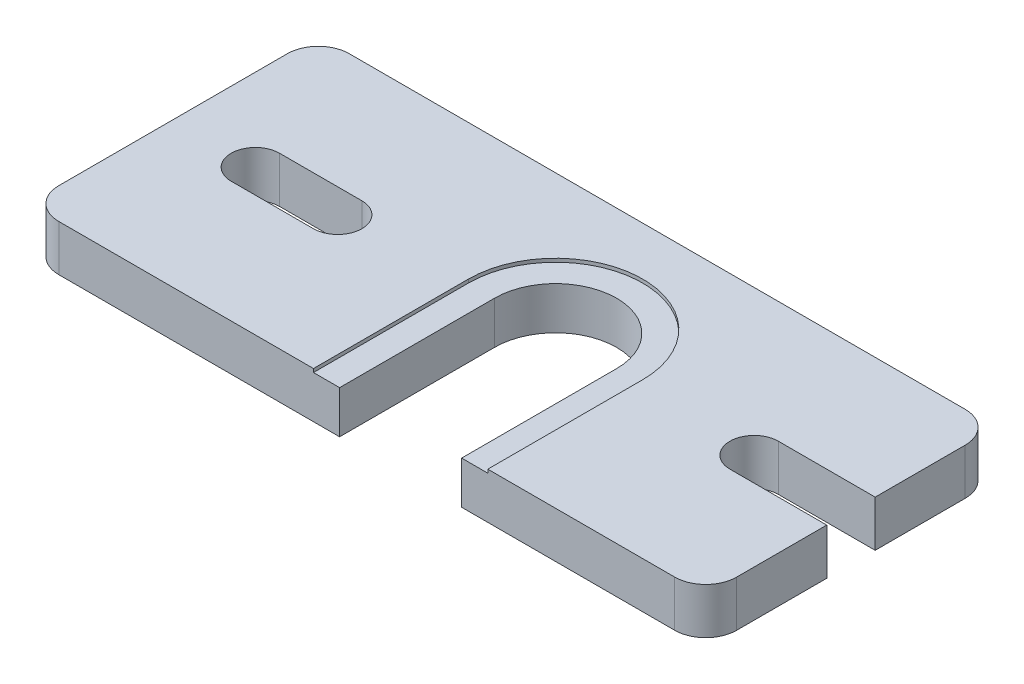
ISO-10303-21;
HEADER;
FILE_DESCRIPTION(('STEP AP214'),'2;1');
FILE_NAME('part.step','',(''),(''),'','','');
FILE_SCHEMA(('AUTOMOTIVE_DESIGN { 1 0 10303 214 1 1 1 1 }'));
ENDSEC;
DATA;
#1=APPLICATION_CONTEXT('core data for automotive mechanical design processes');
#2=APPLICATION_PROTOCOL_DEFINITION('international standard','automotive_design',2000,#1);
#3=PRODUCT_CONTEXT('',#1,'mechanical');
#4=PRODUCT('Part','Part','',(#3));
#5=PRODUCT_RELATED_PRODUCT_CATEGORY('part','',(#4));
#6=PRODUCT_DEFINITION_FORMATION('','',#4);
#7=PRODUCT_DEFINITION_CONTEXT('part definition',#1,'design');
#8=PRODUCT_DEFINITION('design','',#6,#7);
#9=PRODUCT_DEFINITION_SHAPE('','',#8);
#10=(LENGTH_UNIT() NAMED_UNIT(*) SI_UNIT(.MILLI.,.METRE.));
#11=(NAMED_UNIT(*) PLANE_ANGLE_UNIT() SI_UNIT($,.RADIAN.));
#12=(NAMED_UNIT(*) SI_UNIT($,.STERADIAN.) SOLID_ANGLE_UNIT());
#13=UNCERTAINTY_MEASURE_WITH_UNIT(LENGTH_MEASURE(1.E-05),#10,'distance_accuracy_value','');
#14=(GEOMETRIC_REPRESENTATION_CONTEXT(3) GLOBAL_UNCERTAINTY_ASSIGNED_CONTEXT((#13)) GLOBAL_UNIT_ASSIGNED_CONTEXT((#10,
#11,#12)) REPRESENTATION_CONTEXT('',''));
#15=CARTESIAN_POINT('',(0.,0.,0.));
#16=DIRECTION('',(0.,0.,1.));
#17=DIRECTION('',(1.,0.,0.));
#18=AXIS2_PLACEMENT_3D('',#15,#16,#17);
#19=CARTESIAN_POINT('',(-33.3066965235457,-4.4,-13.7944966575127));
#20=DIRECTION('',(0.,1.,0.));
#21=DIRECTION('',(0.,0.,1.));
#22=AXIS2_PLACEMENT_3D('',#19,#20,#21);
#23=PLANE('',#22);
#24=CARTESIAN_POINT('',(-28.0066965235457,-4.4,-1.99449665751267));
#25=DIRECTION('',(0.,1.,0.));
#26=DIRECTION('',(0.,0.,1.));
#27=AXIS2_PLACEMENT_3D('',#24,#25,#26);
#28=CIRCLE('',#27,2.5);
#29=CARTESIAN_POINT('',(-28.0066965235457,-4.4,0.505503342487333));
#30=VERTEX_POINT('',#29);
#31=CARTESIAN_POINT('',(-28.0066965235457,-4.4,-4.49449665751267));
#32=VERTEX_POINT('',#31);
#33=EDGE_CURVE('E343',#30,#32,#28,.F.);
#34=ORIENTED_EDGE('',*,*,#33,.F.);
#35=DIRECTION('',(-1.,0.,0.));
#36=VECTOR('',#35,1.);
#37=CARTESIAN_POINT('',(-33.3066965235457,-4.4,0.505503342487333));
#38=LINE('',#37,#36);
#39=CARTESIAN_POINT('',(-19.5066965235457,-4.4,0.505503342487333));
#40=VERTEX_POINT('',#39);
#41=EDGE_CURVE('E341',#40,#30,#38,.T.);
#42=ORIENTED_EDGE('',*,*,#41,.F.);
#43=CARTESIAN_POINT('',(-19.5066965235457,-4.4,-1.99449665751267));
#44=DIRECTION('',(0.,1.,0.));
#45=DIRECTION('',(0.,0.,1.));
#46=AXIS2_PLACEMENT_3D('',#43,#44,#45);
#47=CIRCLE('',#46,2.5);
#48=CARTESIAN_POINT('',(-19.5066965235457,-4.4,-4.49449665751267));
#49=VERTEX_POINT('',#48);
#50=EDGE_CURVE('E339',#49,#40,#47,.F.);
#51=ORIENTED_EDGE('',*,*,#50,.F.);
#52=DIRECTION('',(-1.,0.,0.));
#53=VECTOR('',#52,1.);
#54=CARTESIAN_POINT('',(-33.3066965235457,-4.4,-4.49449665751267));
#55=LINE('',#54,#53);
#56=EDGE_CURVE('E205',#49,#32,#55,.T.);
#57=ORIENTED_EDGE('',*,*,#56,.T.);
#58=EDGE_LOOP('',(#34,#42,#51,#57));
#59=FACE_BOUND('',#58,.T.);
#60=DIRECTION('',(0.,0.,1.));
#61=VECTOR('',#60,1.);
#62=CARTESIAN_POINT('',(8.29330347645429,-4.4,-13.7944966575127));
#63=LINE('',#62,#61);
#64=CARTESIAN_POINT('',(8.29330347645429,-4.4,-2.99449665751267));
#65=VERTEX_POINT('',#64);
#66=CARTESIAN_POINT('',(8.29330347645429,-4.4,13.0055033424873));
#67=VERTEX_POINT('',#66);
#68=EDGE_CURVE('E315',#65,#67,#63,.T.);
#69=ORIENTED_EDGE('',*,*,#68,.F.);
#70=CARTESIAN_POINT('',(1.99330347645429,-4.4,-2.99449665751267));
#71=DIRECTION('',(0.,1.,0.));
#72=DIRECTION('',(0.,0.,1.));
#73=AXIS2_PLACEMENT_3D('',#70,#71,#72);
#74=CIRCLE('',#73,6.3);
#75=CARTESIAN_POINT('',(-4.30669652354571,-4.4,-2.99449665751267));
#76=VERTEX_POINT('',#75);
#77=EDGE_CURVE('E317',#65,#76,#74,.T.);
#78=ORIENTED_EDGE('',*,*,#77,.T.);
#79=DIRECTION('',(0.,0.,1.));
#80=VECTOR('',#79,1.);
#81=CARTESIAN_POINT('',(-4.30669652354571,-4.4,-13.7944966575127));
#82=LINE('',#81,#80);
#83=CARTESIAN_POINT('',(-4.30669652354571,-4.4,13.0055033424873));
#84=VERTEX_POINT('',#83);
#85=EDGE_CURVE('E312',#76,#84,#82,.T.);
#86=ORIENTED_EDGE('',*,*,#85,.T.);
#87=DIRECTION('',(1.,0.,0.));
#88=VECTOR('',#87,1.);
#89=CARTESIAN_POINT('',(-33.3066965235457,-4.4,13.0055033424873));
#90=LINE('',#89,#88);
#91=CARTESIAN_POINT('',(-33.3066965235457,-4.4,13.0055033424873));
#92=VERTEX_POINT('',#91);
#93=EDGE_CURVE('E358',#92,#84,#90,.T.);
#94=ORIENTED_EDGE('',*,*,#93,.F.);
#95=CARTESIAN_POINT('',(-33.3066965235457,-4.4,9.80550334248733));
#96=DIRECTION('',(0.,1.,0.));
#97=DIRECTION('',(0.,0.,-1.));
#98=AXIS2_PLACEMENT_3D('',#95,#96,#97);
#99=CIRCLE('',#98,3.2);
#100=CARTESIAN_POINT('',(-36.5066965235457,-4.4,9.80550334248731));
#101=VERTEX_POINT('',#100);
#102=EDGE_CURVE('E354',#101,#92,#99,.T.);
#103=ORIENTED_EDGE('',*,*,#102,.F.);
#104=DIRECTION('',(0.,0.,1.));
#105=VECTOR('',#104,1.);
#106=CARTESIAN_POINT('',(-36.5066965235457,-4.4,-13.7944966575126));
#107=LINE('',#106,#105);
#108=CARTESIAN_POINT('',(-36.5066965235457,-4.4,-13.7944966575126));
#109=VERTEX_POINT('',#108);
#110=EDGE_CURVE('E350',#109,#101,#107,.T.);
#111=ORIENTED_EDGE('',*,*,#110,.F.);
#112=CARTESIAN_POINT('',(-33.3066965235457,-4.4,-13.7944966575127));
#113=DIRECTION('',(0.,1.,0.));
#114=DIRECTION('',(0.,0.,1.));
#115=AXIS2_PLACEMENT_3D('',#112,#113,#114);
#116=CIRCLE('',#115,3.2);
#117=CARTESIAN_POINT('',(-33.3066965235457,-4.4,-16.9944966575127));
#118=VERTEX_POINT('',#117);
#119=EDGE_CURVE('E347',#118,#109,#116,.T.);
#120=ORIENTED_EDGE('',*,*,#119,.F.);
#121=DIRECTION('',(-1.,0.,0.));
#122=VECTOR('',#121,1.);
#123=CARTESIAN_POINT('',(-33.3066965235457,-4.4,-16.9944966575127));
#124=LINE('',#123,#122);
#125=CARTESIAN_POINT('',(30.2933034764543,-4.4,-16.9944966575127));
#126=VERTEX_POINT('',#125);
#127=EDGE_CURVE('E371',#126,#118,#124,.T.);
#128=ORIENTED_EDGE('',*,*,#127,.F.);
#129=CARTESIAN_POINT('',(30.2933034764543,-4.4,-13.7944966575127));
#130=DIRECTION('',(0.,1.,0.));
#131=DIRECTION('',(0.,0.,1.));
#132=AXIS2_PLACEMENT_3D('',#129,#130,#131);
#133=CIRCLE('',#132,3.2);
#134=CARTESIAN_POINT('',(33.4933034764543,-4.4,-13.7944966575126));
#135=VERTEX_POINT('',#134);
#136=EDGE_CURVE('E368',#135,#126,#133,.T.);
#137=ORIENTED_EDGE('',*,*,#136,.F.);
#138=DIRECTION('',(0.,0.,-1.));
#139=VECTOR('',#138,1.);
#140=CARTESIAN_POINT('',(33.4933034764543,-4.4,-13.7944966575126));
#141=LINE('',#140,#139);
#142=CARTESIAN_POINT('',(33.4933034764543,-4.4,-4.49449665751267));
#143=VERTEX_POINT('',#142);
#144=EDGE_CURVE('E364',#143,#135,#141,.T.);
#145=ORIENTED_EDGE('',*,*,#144,.F.);
#146=DIRECTION('',(-1.,0.,0.));
#147=VECTOR('',#146,1.);
#148=CARTESIAN_POINT('',(-33.3066965235457,-4.4,-4.49449665751267));
#149=LINE('',#148,#147);
#150=CARTESIAN_POINT('',(23.4933034764543,-4.4,-4.49449665751267));
#151=VERTEX_POINT('',#150);
#152=EDGE_CURVE('E326',#143,#151,#149,.T.);
#153=ORIENTED_EDGE('',*,*,#152,.T.);
#154=CARTESIAN_POINT('',(23.4933034764543,-4.4,-1.99449665751267));
#155=DIRECTION('',(0.,1.,0.));
#156=DIRECTION('',(0.,0.,1.));
#157=AXIS2_PLACEMENT_3D('',#154,#155,#156);
#158=CIRCLE('',#157,2.5);
#159=CARTESIAN_POINT('',(23.4933034764543,-4.4,0.505503342487333));
#160=VERTEX_POINT('',#159);
#161=EDGE_CURVE('E331',#160,#151,#158,.F.);
#162=ORIENTED_EDGE('',*,*,#161,.F.);
#163=DIRECTION('',(-1.,0.,0.));
#164=VECTOR('',#163,1.);
#165=CARTESIAN_POINT('',(-33.3066965235457,-4.4,0.505503342487333));
#166=LINE('',#165,#164);
#167=CARTESIAN_POINT('',(33.4933034764543,-4.4,0.505503342487333));
#168=VERTEX_POINT('',#167);
#169=EDGE_CURVE('E329',#168,#160,#166,.T.);
#170=ORIENTED_EDGE('',*,*,#169,.F.);
#171=CARTESIAN_POINT('',(33.4933034764543,-4.4,9.80550334248731));
#172=VERTEX_POINT('',#171);
#173=EDGE_CURVE('E365',#172,#168,#141,.T.);
#174=ORIENTED_EDGE('',*,*,#173,.F.);
#175=CARTESIAN_POINT('',(30.2933034764543,-4.4,9.80550334248733));
#176=DIRECTION('',(0.,1.,0.));
#177=DIRECTION('',(0.,0.,-1.));
#178=AXIS2_PLACEMENT_3D('',#175,#176,#177);
#179=CIRCLE('',#178,3.2);
#180=CARTESIAN_POINT('',(30.2933034764543,-4.4,13.0055033424873));
#181=VERTEX_POINT('',#180);
#182=EDGE_CURVE('E361',#181,#172,#179,.T.);
#183=ORIENTED_EDGE('',*,*,#182,.F.);
#184=EDGE_CURVE('E357',#67,#181,#90,.T.);
#185=ORIENTED_EDGE('',*,*,#184,.F.);
#186=EDGE_LOOP('',(#69,#78,#86,#94,#103,#111,#120,#128,#137,#145,#153,#162,#170,#174,#183,#185));
#187=FACE_BOUND('',#186,.T.);
#188=ADVANCED_FACE('F37',(#59,#187),#23,.F.);
#189=CARTESIAN_POINT('',(-33.3066965235457,0.,-13.7944966575127));
#190=DIRECTION('',(0.,1.,0.));
#191=DIRECTION('',(0.,0.,1.));
#192=AXIS2_PLACEMENT_3D('',#189,#190,#191);
#193=PLANE('',#192);
#194=DIRECTION('',(0.,0.,1.));
#195=VECTOR('',#194,1.);
#196=CARTESIAN_POINT('',(10.9933034764543,0.,-2.99449665751267));
#197=LINE('',#196,#195);
#198=CARTESIAN_POINT('',(10.9933034764543,0.,-2.99449665751267));
#199=VERTEX_POINT('',#198);
#200=CARTESIAN_POINT('',(10.9933034764543,0.,13.0055033424873));
#201=VERTEX_POINT('',#200);
#202=EDGE_CURVE('E54',#199,#201,#197,.T.);
#203=ORIENTED_EDGE('',*,*,#202,.F.);
#204=CARTESIAN_POINT('',(1.99330347645429,0.,-2.99449665751267));
#205=DIRECTION('',(0.,-1.,0.));
#206=DIRECTION('',(0.,0.,1.));
#207=AXIS2_PLACEMENT_3D('',#204,#205,#206);
#208=CIRCLE('',#207,9.);
#209=CARTESIAN_POINT('',(-7.00669652354571,0.,-2.99449665751267));
#210=VERTEX_POINT('',#209);
#211=EDGE_CURVE('E272',#210,#199,#208,.T.);
#212=ORIENTED_EDGE('',*,*,#211,.F.);
#213=DIRECTION('',(0.,0.,-1.));
#214=VECTOR('',#213,1.);
#215=CARTESIAN_POINT('',(-7.00669652354571,0.,-2.99449665751267));
#216=LINE('',#215,#214);
#217=CARTESIAN_POINT('',(-7.00669652354571,0.,13.0055033424873));
#218=VERTEX_POINT('',#217);
#219=EDGE_CURVE('E60',#218,#210,#216,.T.);
#220=ORIENTED_EDGE('',*,*,#219,.F.);
#221=DIRECTION('',(1.,0.,0.));
#222=VECTOR('',#221,1.);
#223=CARTESIAN_POINT('',(-33.3066965235457,0.,13.0055033424873));
#224=LINE('',#223,#222);
#225=CARTESIAN_POINT('',(-4.30669652354571,0.,13.0055033424873));
#226=VERTEX_POINT('',#225);
#227=EDGE_CURVE('E351',#218,#226,#224,.T.);
#228=ORIENTED_EDGE('',*,*,#227,.T.);
#229=DIRECTION('',(0.,0.,1.));
#230=VECTOR('',#229,1.);
#231=CARTESIAN_POINT('',(-4.30669652354571,0.,-2.99449665751267));
#232=LINE('',#231,#230);
#233=CARTESIAN_POINT('',(-4.30669652354571,0.,-2.99449665751267));
#234=VERTEX_POINT('',#233);
#235=EDGE_CURVE('E302',#234,#226,#232,.T.);
#236=ORIENTED_EDGE('',*,*,#235,.F.);
#237=CARTESIAN_POINT('',(1.99330347645429,0.,-2.99449665751267));
#238=DIRECTION('',(0.,1.,0.));
#239=DIRECTION('',(0.,0.,1.));
#240=AXIS2_PLACEMENT_3D('',#237,#238,#239);
#241=CIRCLE('',#240,6.3);
#242=CARTESIAN_POINT('',(8.29330347645429,0.,-2.99449665751267));
#243=VERTEX_POINT('',#242);
#244=EDGE_CURVE('E305',#243,#234,#241,.T.);
#245=ORIENTED_EDGE('',*,*,#244,.F.);
#246=DIRECTION('',(0.,0.,1.));
#247=VECTOR('',#246,1.);
#248=CARTESIAN_POINT('',(8.29330347645429,0.,-2.99449665751267));
#249=LINE('',#248,#247);
#250=CARTESIAN_POINT('',(8.29330347645429,0.,13.0055033424873));
#251=VERTEX_POINT('',#250);
#252=EDGE_CURVE('E298',#243,#251,#249,.T.);
#253=ORIENTED_EDGE('',*,*,#252,.T.);
#254=EDGE_CURVE('E346',#251,#201,#224,.T.);
#255=ORIENTED_EDGE('',*,*,#254,.T.);
#256=EDGE_LOOP('',(#203,#212,#220,#228,#236,#245,#253,#255));
#257=FACE_BOUND('',#256,.T.);
#258=ADVANCED_FACE('F435',(#257),#193,.T.);
#259=CARTESIAN_POINT('',(-33.3066965235457,-4.4,13.0055033424873));
#260=DIRECTION('',(0.,0.,1.));
#261=DIRECTION('',(1.,0.,0.));
#262=AXIS2_PLACEMENT_3D('',#259,#260,#261);
#263=PLANE('',#262);
#264=DIRECTION('',(0.,1.,0.));
#265=VECTOR('',#264,1.);
#266=CARTESIAN_POINT('',(8.29330347645429,-4.76,13.0055033424873));
#267=LINE('',#266,#265);
#268=EDGE_CURVE('E11',#67,#251,#267,.T.);
#269=ORIENTED_EDGE('',*,*,#268,.F.);
#270=ORIENTED_EDGE('',*,*,#184,.T.);
#271=DIRECTION('',(0.,1.,0.));
#272=VECTOR('',#271,1.);
#273=CARTESIAN_POINT('',(30.2933034764543,-4.4,13.0055033424873));
#274=LINE('',#273,#272);
#275=CARTESIAN_POINT('',(30.2933034764543,0.36,13.0055033424873));
#276=VERTEX_POINT('',#275);
#277=EDGE_CURVE('E394',#181,#276,#274,.T.);
#278=ORIENTED_EDGE('',*,*,#277,.T.);
#279=DIRECTION('',(1.,0.,0.));
#280=VECTOR('',#279,1.);
#281=CARTESIAN_POINT('',(10.9933034764543,0.36,13.0055033424873));
#282=LINE('',#281,#280);
#283=CARTESIAN_POINT('',(10.9933034764543,0.36,13.0055033424873));
#284=VERTEX_POINT('',#283);
#285=EDGE_CURVE('E244',#284,#276,#282,.T.);
#286=ORIENTED_EDGE('',*,*,#285,.F.);
#287=DIRECTION('',(0.,-1.,0.));
#288=VECTOR('',#287,1.);
#289=CARTESIAN_POINT('',(10.9933034764543,0.36,13.0055033424873));
#290=LINE('',#289,#288);
#291=EDGE_CURVE('E271',#284,#201,#290,.T.);
#292=ORIENTED_EDGE('',*,*,#291,.T.);
#293=ORIENTED_EDGE('',*,*,#254,.F.);
#294=EDGE_LOOP('',(#269,#270,#278,#286,#292,#293));
#295=FACE_BOUND('',#294,.T.);
#296=ADVANCED_FACE('F442',(#295),#263,.T.);
#297=CARTESIAN_POINT('',(33.4933034764543,-4.4,-13.7944966575126));
#298=DIRECTION('',(1.,0.,0.));
#299=DIRECTION('',(0.,0.,-1.));
#300=AXIS2_PLACEMENT_3D('',#297,#298,#299);
#301=PLANE('',#300);
#302=ORIENTED_EDGE('',*,*,#173,.T.);
#303=DIRECTION('',(0.,-1.,0.));
#304=VECTOR('',#303,1.);
#305=CARTESIAN_POINT('',(33.4933034764543,10.36,0.505503342487333));
#306=LINE('',#305,#304);
#307=CARTESIAN_POINT('',(33.4933034764543,0.36,0.505503342487333));
#308=VERTEX_POINT('',#307);
#309=EDGE_CURVE('E385',#168,#308,#306,.F.);
#310=ORIENTED_EDGE('',*,*,#309,.T.);
#311=DIRECTION('',(0.,0.,-1.));
#312=VECTOR('',#311,1.);
#313=CARTESIAN_POINT('',(33.4933034764543,0.36,9.80550334248731));
#314=LINE('',#313,#312);
#315=CARTESIAN_POINT('',(33.4933034764543,0.36,9.80550334248731));
#316=VERTEX_POINT('',#315);
#317=EDGE_CURVE('E250',#316,#308,#314,.T.);
#318=ORIENTED_EDGE('',*,*,#317,.F.);
#319=DIRECTION('',(0.,1.,0.));
#320=VECTOR('',#319,1.);
#321=CARTESIAN_POINT('',(33.4933034764543,-4.4,9.80550334248731));
#322=LINE('',#321,#320);
#323=EDGE_CURVE('E396',#172,#316,#322,.T.);
#324=ORIENTED_EDGE('',*,*,#323,.F.);
#325=EDGE_LOOP('',(#302,#310,#318,#324));
#326=FACE_BOUND('',#325,.T.);
#327=ADVANCED_FACE('F451',(#326),#301,.T.);
#328=CARTESIAN_POINT('',(-33.3066965235457,-4.4,-13.7944966575127));
#329=DIRECTION('',(0.,1.,0.));
#330=DIRECTION('',(0.,0.,1.));
#331=AXIS2_PLACEMENT_3D('',#328,#329,#330);
#332=CYLINDRICAL_SURFACE('',#331,3.2);
#333=DIRECTION('',(0.,1.,0.));
#334=VECTOR('',#333,1.);
#335=CARTESIAN_POINT('',(-36.5066965235457,-4.4,-13.7944966575126));
#336=LINE('',#335,#334);
#337=CARTESIAN_POINT('',(-36.5066965235457,0.36,-13.7944966575126));
#338=VERTEX_POINT('',#337);
#339=EDGE_CURVE('E374',#109,#338,#336,.T.);
#340=ORIENTED_EDGE('',*,*,#339,.T.);
#341=CARTESIAN_POINT('',(-33.3066965235457,0.36,-13.7944966575127));
#342=DIRECTION('',(0.,1.,0.));
#343=DIRECTION('',(0.,0.,1.));
#344=AXIS2_PLACEMENT_3D('',#341,#342,#343);
#345=CIRCLE('',#344,3.2);
#346=CARTESIAN_POINT('',(-33.3066965235457,0.36,-16.9944966575127));
#347=VERTEX_POINT('',#346);
#348=EDGE_CURVE('E227',#347,#338,#345,.T.);
#349=ORIENTED_EDGE('',*,*,#348,.F.);
#350=DIRECTION('',(0.,1.,0.));
#351=VECTOR('',#350,1.);
#352=CARTESIAN_POINT('',(-33.3066965235457,-4.4,-16.9944966575127));
#353=LINE('',#352,#351);
#354=EDGE_CURVE('E377',#118,#347,#353,.T.);
#355=ORIENTED_EDGE('',*,*,#354,.F.);
#356=ORIENTED_EDGE('',*,*,#119,.T.);
#357=EDGE_LOOP('',(#340,#349,#355,#356));
#358=FACE_BOUND('',#357,.T.);
#359=ADVANCED_FACE('F39',(#358),#332,.T.);
#360=CARTESIAN_POINT('',(-33.3066965235457,-4.4,-16.9944966575127));
#361=DIRECTION('',(0.,0.,-1.));
#362=DIRECTION('',(-1.,0.,0.));
#363=AXIS2_PLACEMENT_3D('',#360,#361,#362);
#364=PLANE('',#363);
#365=ORIENTED_EDGE('',*,*,#354,.T.);
#366=DIRECTION('',(-1.,0.,0.));
#367=VECTOR('',#366,1.);
#368=CARTESIAN_POINT('',(30.2933034764543,0.36,-16.9944966575127));
#369=LINE('',#368,#367);
#370=CARTESIAN_POINT('',(30.2933034764543,0.36,-16.9944966575127));
#371=VERTEX_POINT('',#370);
#372=EDGE_CURVE('E268',#371,#347,#369,.T.);
#373=ORIENTED_EDGE('',*,*,#372,.F.);
#374=DIRECTION('',(0.,1.,0.));
#375=VECTOR('',#374,1.);
#376=CARTESIAN_POINT('',(30.2933034764543,-4.4,-16.9944966575127));
#377=LINE('',#376,#375);
#378=EDGE_CURVE('E399',#126,#371,#377,.T.);
#379=ORIENTED_EDGE('',*,*,#378,.F.);
#380=ORIENTED_EDGE('',*,*,#127,.T.);
#381=EDGE_LOOP('',(#365,#373,#379,#380));
#382=FACE_BOUND('',#381,.T.);
#383=ADVANCED_FACE('F404',(#382),#364,.T.);
#384=CARTESIAN_POINT('',(30.2933034764543,-4.4,-13.7944966575127));
#385=DIRECTION('',(0.,1.,0.));
#386=DIRECTION('',(0.,0.,1.));
#387=AXIS2_PLACEMENT_3D('',#384,#385,#386);
#388=CYLINDRICAL_SURFACE('',#387,3.2);
#389=ORIENTED_EDGE('',*,*,#378,.T.);
#390=CARTESIAN_POINT('',(30.2933034764543,0.36,-13.7944966575127));
#391=DIRECTION('',(0.,1.,0.));
#392=DIRECTION('',(0.,0.,1.));
#393=AXIS2_PLACEMENT_3D('',#390,#391,#392);
#394=CIRCLE('',#393,3.2);
#395=CARTESIAN_POINT('',(33.4933034764543,0.36,-13.7944966575126));
#396=VERTEX_POINT('',#395);
#397=EDGE_CURVE('E265',#396,#371,#394,.T.);
#398=ORIENTED_EDGE('',*,*,#397,.F.);
#399=DIRECTION('',(0.,1.,0.));
#400=VECTOR('',#399,1.);
#401=CARTESIAN_POINT('',(33.4933034764543,-4.4,-13.7944966575126));
#402=LINE('',#401,#400);
#403=EDGE_CURVE('E398',#135,#396,#402,.T.);
#404=ORIENTED_EDGE('',*,*,#403,.F.);
#405=ORIENTED_EDGE('',*,*,#136,.T.);
#406=EDGE_LOOP('',(#389,#398,#404,#405));
#407=FACE_BOUND('',#406,.T.);
#408=ADVANCED_FACE('F471',(#407),#388,.T.);
#409=DIRECTION('',(0.,1.,0.));
#410=VECTOR('',#409,1.);
#411=CARTESIAN_POINT('',(33.4933034764543,-4.4,-4.49449665751267));
#412=LINE('',#411,#410);
#413=CARTESIAN_POINT('',(33.4933034764543,0.36,-4.49449665751267));
#414=VERTEX_POINT('',#413);
#415=EDGE_CURVE('E387',#143,#414,#412,.T.);
#416=ORIENTED_EDGE('',*,*,#415,.F.);
#417=ORIENTED_EDGE('',*,*,#144,.T.);
#418=ORIENTED_EDGE('',*,*,#403,.T.);
#419=DIRECTION('',(0.,0.,-1.));
#420=VECTOR('',#419,1.);
#421=CARTESIAN_POINT('',(33.4933034764543,0.36,-4.49449665751267));
#422=LINE('',#421,#420);
#423=EDGE_CURVE('E262',#414,#396,#422,.T.);
#424=ORIENTED_EDGE('',*,*,#423,.F.);
#425=EDGE_LOOP('',(#416,#417,#418,#424));
#426=FACE_BOUND('',#425,.T.);
#427=ADVANCED_FACE('F468',(#426),#301,.T.);
#428=CARTESIAN_POINT('',(30.2933034764543,-4.4,9.80550334248733));
#429=DIRECTION('',(0.,1.,0.));
#430=DIRECTION('',(0.,0.,1.));
#431=AXIS2_PLACEMENT_3D('',#428,#429,#430);
#432=CYLINDRICAL_SURFACE('',#431,3.2);
#433=ORIENTED_EDGE('',*,*,#323,.T.);
#434=CARTESIAN_POINT('',(30.2933034764543,0.36,9.80550334248733));
#435=DIRECTION('',(0.,1.,0.));
#436=DIRECTION('',(0.,0.,1.));
#437=AXIS2_PLACEMENT_3D('',#434,#435,#436);
#438=CIRCLE('',#437,3.2);
#439=EDGE_CURVE('E247',#276,#316,#438,.T.);
#440=ORIENTED_EDGE('',*,*,#439,.F.);
#441=ORIENTED_EDGE('',*,*,#277,.F.);
#442=ORIENTED_EDGE('',*,*,#182,.T.);
#443=EDGE_LOOP('',(#433,#440,#441,#442));
#444=FACE_BOUND('',#443,.T.);
#445=ADVANCED_FACE('F447',(#444),#432,.T.);
#446=DIRECTION('',(0.,-1.,0.));
#447=VECTOR('',#446,1.);
#448=CARTESIAN_POINT('',(-4.30669652354571,-4.4,13.0055033424873));
#449=LINE('',#448,#447);
#450=EDGE_CURVE('E46',#226,#84,#449,.T.);
#451=ORIENTED_EDGE('',*,*,#450,.F.);
#452=ORIENTED_EDGE('',*,*,#227,.F.);
#453=DIRECTION('',(0.,-1.,0.));
#454=VECTOR('',#453,1.);
#455=CARTESIAN_POINT('',(-7.00669652354571,0.36,13.0055033424873));
#456=LINE('',#455,#454);
#457=CARTESIAN_POINT('',(-7.00669652354571,0.36,13.0055033424873));
#458=VERTEX_POINT('',#457);
#459=EDGE_CURVE('E293',#458,#218,#456,.T.);
#460=ORIENTED_EDGE('',*,*,#459,.F.);
#461=DIRECTION('',(1.,0.,0.));
#462=VECTOR('',#461,1.);
#463=CARTESIAN_POINT('',(-33.3066965235457,0.36,13.0055033424873));
#464=LINE('',#463,#462);
#465=CARTESIAN_POINT('',(-33.3066965235457,0.36,13.0055033424873));
#466=VERTEX_POINT('',#465);
#467=EDGE_CURVE('E236',#466,#458,#464,.T.);
#468=ORIENTED_EDGE('',*,*,#467,.F.);
#469=DIRECTION('',(0.,1.,0.));
#470=VECTOR('',#469,1.);
#471=CARTESIAN_POINT('',(-33.3066965235457,-4.4,13.0055033424873));
#472=LINE('',#471,#470);
#473=EDGE_CURVE('E392',#92,#466,#472,.T.);
#474=ORIENTED_EDGE('',*,*,#473,.F.);
#475=ORIENTED_EDGE('',*,*,#93,.T.);
#476=EDGE_LOOP('',(#451,#452,#460,#468,#474,#475));
#477=FACE_BOUND('',#476,.T.);
#478=ADVANCED_FACE('F422',(#477),#263,.T.);
#479=CARTESIAN_POINT('',(-33.3066965235457,-4.4,9.80550334248733));
#480=DIRECTION('',(0.,1.,0.));
#481=DIRECTION('',(0.,0.,1.));
#482=AXIS2_PLACEMENT_3D('',#479,#480,#481);
#483=CYLINDRICAL_SURFACE('',#482,3.2);
#484=ORIENTED_EDGE('',*,*,#473,.T.);
#485=CARTESIAN_POINT('',(-33.3066965235457,0.36,9.80550334248733));
#486=DIRECTION('',(0.,1.,0.));
#487=DIRECTION('',(0.,0.,1.));
#488=AXIS2_PLACEMENT_3D('',#485,#486,#487);
#489=CIRCLE('',#488,3.2);
#490=CARTESIAN_POINT('',(-36.5066965235457,0.36,9.80550334248731));
#491=VERTEX_POINT('',#490);
#492=EDGE_CURVE('E233',#491,#466,#489,.T.);
#493=ORIENTED_EDGE('',*,*,#492,.F.);
#494=DIRECTION('',(0.,1.,0.));
#495=VECTOR('',#494,1.);
#496=CARTESIAN_POINT('',(-36.5066965235457,-4.4,9.80550334248731));
#497=LINE('',#496,#495);
#498=EDGE_CURVE('E390',#101,#491,#497,.T.);
#499=ORIENTED_EDGE('',*,*,#498,.F.);
#500=ORIENTED_EDGE('',*,*,#102,.T.);
#501=EDGE_LOOP('',(#484,#493,#499,#500));
#502=FACE_BOUND('',#501,.T.);
#503=ADVANCED_FACE('F417',(#502),#483,.T.);
#504=CARTESIAN_POINT('',(-36.5066965235457,-4.4,-13.7944966575126));
#505=DIRECTION('',(-1.,0.,0.));
#506=DIRECTION('',(0.,0.,1.));
#507=AXIS2_PLACEMENT_3D('',#504,#505,#506);
#508=PLANE('',#507);
#509=ORIENTED_EDGE('',*,*,#498,.T.);
#510=DIRECTION('',(0.,0.,1.));
#511=VECTOR('',#510,1.);
#512=CARTESIAN_POINT('',(-36.5066965235457,0.36,-13.7944966575126));
#513=LINE('',#512,#511);
#514=EDGE_CURVE('E230',#338,#491,#513,.T.);
#515=ORIENTED_EDGE('',*,*,#514,.F.);
#516=ORIENTED_EDGE('',*,*,#339,.F.);
#517=ORIENTED_EDGE('',*,*,#110,.T.);
#518=EDGE_LOOP('',(#509,#515,#516,#517));
#519=FACE_BOUND('',#518,.T.);
#520=ADVANCED_FACE('F413',(#519),#508,.T.);
#521=CARTESIAN_POINT('',(-28.0066965235457,10.36,-1.99449665751267));
#522=DIRECTION('',(0.,-1.,0.));
#523=DIRECTION('',(0.,0.,-1.));
#524=AXIS2_PLACEMENT_3D('',#521,#522,#523);
#525=CYLINDRICAL_SURFACE('',#524,2.5);
#526=ORIENTED_EDGE('',*,*,#33,.T.);
#527=DIRECTION('',(0.,-1.,0.));
#528=VECTOR('',#527,1.);
#529=CARTESIAN_POINT('',(-28.0066965235457,10.36,-4.49449665751267));
#530=LINE('',#529,#528);
#531=CARTESIAN_POINT('',(-28.0066965235457,0.36,-4.49449665751267));
#532=VERTEX_POINT('',#531);
#533=EDGE_CURVE('E209',#532,#32,#530,.T.);
#534=ORIENTED_EDGE('',*,*,#533,.F.);
#535=CARTESIAN_POINT('',(-28.0066965235457,0.36,-1.99449665751267));
#536=DIRECTION('',(0.,1.,0.));
#537=DIRECTION('',(0.,0.,1.));
#538=AXIS2_PLACEMENT_3D('',#535,#536,#537);
#539=CIRCLE('',#538,2.5);
#540=CARTESIAN_POINT('',(-28.0066965235457,0.36,0.505503342487333));
#541=VERTEX_POINT('',#540);
#542=EDGE_CURVE('E221',#532,#541,#539,.T.);
#543=ORIENTED_EDGE('',*,*,#542,.T.);
#544=DIRECTION('',(0.,-1.,0.));
#545=VECTOR('',#544,1.);
#546=CARTESIAN_POINT('',(-28.0066965235457,10.36,0.505503342487333));
#547=LINE('',#546,#545);
#548=EDGE_CURVE('E335',#541,#30,#547,.T.);
#549=ORIENTED_EDGE('',*,*,#548,.T.);
#550=EDGE_LOOP('',(#526,#534,#543,#549));
#551=FACE_BOUND('',#550,.T.);
#552=ADVANCED_FACE('F489',(#551),#525,.F.);
#553=CARTESIAN_POINT('',(-28.0066965235457,10.36,0.505503342487333));
#554=DIRECTION('',(0.,0.,-1.));
#555=DIRECTION('',(-1.,0.,0.));
#556=AXIS2_PLACEMENT_3D('',#553,#554,#555);
#557=PLANE('',#556);
#558=ORIENTED_EDGE('',*,*,#41,.T.);
#559=ORIENTED_EDGE('',*,*,#548,.F.);
#560=DIRECTION('',(1.,0.,0.));
#561=VECTOR('',#560,1.);
#562=CARTESIAN_POINT('',(-19.5066965235457,0.36,0.505503342487333));
#563=LINE('',#562,#561);
#564=CARTESIAN_POINT('',(-19.5066965235457,0.36,0.505503342487333));
#565=VERTEX_POINT('',#564);
#566=EDGE_CURVE('E223',#541,#565,#563,.T.);
#567=ORIENTED_EDGE('',*,*,#566,.T.);
#568=DIRECTION('',(0.,-1.,0.));
#569=VECTOR('',#568,1.);
#570=CARTESIAN_POINT('',(-19.5066965235457,10.36,0.505503342487333));
#571=LINE('',#570,#569);
#572=EDGE_CURVE('E208',#565,#40,#571,.T.);
#573=ORIENTED_EDGE('',*,*,#572,.T.);
#574=EDGE_LOOP('',(#558,#559,#567,#573));
#575=FACE_BOUND('',#574,.T.);
#576=ADVANCED_FACE('F492',(#575),#557,.T.);
#577=CARTESIAN_POINT('',(-19.5066965235457,10.36,-1.99449665751267));
#578=DIRECTION('',(0.,-1.,0.));
#579=DIRECTION('',(0.,0.,-1.));
#580=AXIS2_PLACEMENT_3D('',#577,#578,#579);
#581=CYLINDRICAL_SURFACE('',#580,2.5);
#582=ORIENTED_EDGE('',*,*,#50,.T.);
#583=ORIENTED_EDGE('',*,*,#572,.F.);
#584=CARTESIAN_POINT('',(-19.5066965235457,0.36,-1.99449665751267));
#585=DIRECTION('',(0.,1.,0.));
#586=DIRECTION('',(0.,0.,1.));
#587=AXIS2_PLACEMENT_3D('',#584,#585,#586);
#588=CIRCLE('',#587,2.5);
#589=CARTESIAN_POINT('',(-19.5066965235457,0.36,-4.49449665751267));
#590=VERTEX_POINT('',#589);
#591=EDGE_CURVE('E212',#565,#590,#588,.T.);
#592=ORIENTED_EDGE('',*,*,#591,.T.);
#593=DIRECTION('',(0.,-1.,0.));
#594=VECTOR('',#593,1.);
#595=CARTESIAN_POINT('',(-19.5066965235457,10.36,-4.49449665751267));
#596=LINE('',#595,#594);
#597=EDGE_CURVE('E198',#590,#49,#596,.T.);
#598=ORIENTED_EDGE('',*,*,#597,.T.);
#599=EDGE_LOOP('',(#582,#583,#592,#598));
#600=FACE_BOUND('',#599,.T.);
#601=ADVANCED_FACE('F213',(#600),#581,.F.);
#602=CARTESIAN_POINT('',(-28.0066965235457,10.36,-4.49449665751267));
#603=DIRECTION('',(0.,0.,-1.));
#604=DIRECTION('',(-1.,0.,0.));
#605=AXIS2_PLACEMENT_3D('',#602,#603,#604);
#606=PLANE('',#605);
#607=ORIENTED_EDGE('',*,*,#597,.F.);
#608=DIRECTION('',(-1.,0.,0.));
#609=VECTOR('',#608,1.);
#610=CARTESIAN_POINT('',(-19.5066965235457,0.36,-4.49449665751267));
#611=LINE('',#610,#609);
#612=EDGE_CURVE('E202',#590,#532,#611,.T.);
#613=ORIENTED_EDGE('',*,*,#612,.T.);
#614=ORIENTED_EDGE('',*,*,#533,.T.);
#615=ORIENTED_EDGE('',*,*,#56,.F.);
#616=EDGE_LOOP('',(#607,#613,#614,#615));
#617=FACE_BOUND('',#616,.T.);
#618=ADVANCED_FACE('F200',(#617),#606,.F.);
#619=CARTESIAN_POINT('',(23.4933034764543,10.36,-1.99449665751267));
#620=DIRECTION('',(0.,-1.,0.));
#621=DIRECTION('',(0.,0.,-1.));
#622=AXIS2_PLACEMENT_3D('',#619,#620,#621);
#623=CYLINDRICAL_SURFACE('',#622,2.5);
#624=ORIENTED_EDGE('',*,*,#161,.T.);
#625=DIRECTION('',(0.,-1.,0.));
#626=VECTOR('',#625,1.);
#627=CARTESIAN_POINT('',(23.4933034764543,10.36,-4.49449665751267));
#628=LINE('',#627,#626);
#629=CARTESIAN_POINT('',(23.4933034764543,0.36,-4.49449665751267));
#630=VERTEX_POINT('',#629);
#631=EDGE_CURVE('E323',#630,#151,#628,.T.);
#632=ORIENTED_EDGE('',*,*,#631,.F.);
#633=CARTESIAN_POINT('',(23.4933034764543,0.36,-1.99449665751267));
#634=DIRECTION('',(0.,-1.,0.));
#635=DIRECTION('',(0.,0.,1.));
#636=AXIS2_PLACEMENT_3D('',#633,#634,#635);
#637=CIRCLE('',#636,2.5);
#638=CARTESIAN_POINT('',(23.4933034764543,0.36,0.505503342487333));
#639=VERTEX_POINT('',#638);
#640=EDGE_CURVE('E256',#639,#630,#637,.T.);
#641=ORIENTED_EDGE('',*,*,#640,.F.);
#642=DIRECTION('',(0.,-1.,0.));
#643=VECTOR('',#642,1.);
#644=CARTESIAN_POINT('',(23.4933034764543,10.36,0.505503342487333));
#645=LINE('',#644,#643);
#646=EDGE_CURVE('E320',#639,#160,#645,.T.);
#647=ORIENTED_EDGE('',*,*,#646,.T.);
#648=EDGE_LOOP('',(#624,#632,#641,#647));
#649=FACE_BOUND('',#648,.T.);
#650=ADVANCED_FACE('F460',(#649),#623,.F.);
#651=CARTESIAN_POINT('',(23.4933034764543,10.36,0.505503342487333));
#652=DIRECTION('',(0.,0.,-1.));
#653=DIRECTION('',(-1.,0.,0.));
#654=AXIS2_PLACEMENT_3D('',#651,#652,#653);
#655=PLANE('',#654);
#656=ORIENTED_EDGE('',*,*,#169,.T.);
#657=ORIENTED_EDGE('',*,*,#646,.F.);
#658=DIRECTION('',(-1.,0.,0.));
#659=VECTOR('',#658,1.);
#660=CARTESIAN_POINT('',(23.4933034764543,0.36,0.505503342487333));
#661=LINE('',#660,#659);
#662=EDGE_CURVE('E253',#308,#639,#661,.T.);
#663=ORIENTED_EDGE('',*,*,#662,.F.);
#664=ORIENTED_EDGE('',*,*,#309,.F.);
#665=EDGE_LOOP('',(#656,#657,#663,#664));
#666=FACE_BOUND('',#665,.T.);
#667=ADVANCED_FACE('F456',(#666),#655,.T.);
#668=CARTESIAN_POINT('',(23.4933034764543,10.36,-4.49449665751267));
#669=DIRECTION('',(0.,0.,-1.));
#670=DIRECTION('',(-1.,0.,0.));
#671=AXIS2_PLACEMENT_3D('',#668,#669,#670);
#672=PLANE('',#671);
#673=ORIENTED_EDGE('',*,*,#415,.T.);
#674=DIRECTION('',(1.,0.,0.));
#675=VECTOR('',#674,1.);
#676=CARTESIAN_POINT('',(23.4933034764543,0.36,-4.49449665751267));
#677=LINE('',#676,#675);
#678=EDGE_CURVE('E259',#630,#414,#677,.T.);
#679=ORIENTED_EDGE('',*,*,#678,.F.);
#680=ORIENTED_EDGE('',*,*,#631,.T.);
#681=ORIENTED_EDGE('',*,*,#152,.F.);
#682=EDGE_LOOP('',(#673,#679,#680,#681));
#683=FACE_BOUND('',#682,.T.);
#684=ADVANCED_FACE('F464',(#683),#672,.F.);
#685=CARTESIAN_POINT('',(1.99330347645429,-4.76,-2.99449665751267));
#686=DIRECTION('',(0.,1.,0.));
#687=DIRECTION('',(0.,0.,1.));
#688=AXIS2_PLACEMENT_3D('',#685,#686,#687);
#689=CYLINDRICAL_SURFACE('',#688,6.3);
#690=DIRECTION('',(0.,1.,0.));
#691=VECTOR('',#690,1.);
#692=CARTESIAN_POINT('',(8.29330347645429,-4.76,-2.99449665751267));
#693=LINE('',#692,#691);
#694=EDGE_CURVE('E308',#65,#243,#693,.T.);
#695=ORIENTED_EDGE('',*,*,#694,.T.);
#696=ORIENTED_EDGE('',*,*,#244,.T.);
#697=DIRECTION('',(0.,1.,0.));
#698=VECTOR('',#697,1.);
#699=CARTESIAN_POINT('',(-4.30669652354571,-4.76,-2.99449665751267));
#700=LINE('',#699,#698);
#701=EDGE_CURVE('E310',#76,#234,#700,.T.);
#702=ORIENTED_EDGE('',*,*,#701,.F.);
#703=ORIENTED_EDGE('',*,*,#77,.F.);
#704=EDGE_LOOP('',(#695,#696,#702,#703));
#705=FACE_BOUND('',#704,.T.);
#706=ADVANCED_FACE('F430',(#705),#689,.F.);
#707=CARTESIAN_POINT('',(8.29330347645429,-4.76,-2.99449665751267));
#708=DIRECTION('',(-1.,0.,0.));
#709=DIRECTION('',(0.,0.,1.));
#710=AXIS2_PLACEMENT_3D('',#707,#708,#709);
#711=PLANE('',#710);
#712=ORIENTED_EDGE('',*,*,#68,.T.);
#713=ORIENTED_EDGE('',*,*,#268,.T.);
#714=ORIENTED_EDGE('',*,*,#252,.F.);
#715=ORIENTED_EDGE('',*,*,#694,.F.);
#716=EDGE_LOOP('',(#712,#713,#714,#715));
#717=FACE_BOUND('',#716,.T.);
#718=ADVANCED_FACE('F507',(#717),#711,.T.);
#719=CARTESIAN_POINT('',(-4.30669652354571,-4.76,-2.99449665751267));
#720=DIRECTION('',(-1.,0.,0.));
#721=DIRECTION('',(0.,0.,1.));
#722=AXIS2_PLACEMENT_3D('',#719,#720,#721);
#723=PLANE('',#722);
#724=ORIENTED_EDGE('',*,*,#701,.T.);
#725=ORIENTED_EDGE('',*,*,#235,.T.);
#726=ORIENTED_EDGE('',*,*,#450,.T.);
#727=ORIENTED_EDGE('',*,*,#85,.F.);
#728=EDGE_LOOP('',(#724,#725,#726,#727));
#729=FACE_BOUND('',#728,.T.);
#730=ADVANCED_FACE('F428',(#729),#723,.F.);
#731=CARTESIAN_POINT('',(-33.3066965235457,0.36,-13.7944966575127));
#732=DIRECTION('',(0.,1.,0.));
#733=DIRECTION('',(0.,0.,1.));
#734=AXIS2_PLACEMENT_3D('',#731,#732,#733);
#735=PLANE('',#734);
#736=ORIENTED_EDGE('',*,*,#348,.T.);
#737=ORIENTED_EDGE('',*,*,#514,.T.);
#738=ORIENTED_EDGE('',*,*,#492,.T.);
#739=ORIENTED_EDGE('',*,*,#467,.T.);
#740=DIRECTION('',(0.,0.,-1.));
#741=VECTOR('',#740,1.);
#742=CARTESIAN_POINT('',(-7.00669652354571,0.36,-2.99449665751267));
#743=LINE('',#742,#741);
#744=CARTESIAN_POINT('',(-7.00669652354571,0.36,-2.99449665751267));
#745=VERTEX_POINT('',#744);
#746=EDGE_CURVE('E238',#458,#745,#743,.T.);
#747=ORIENTED_EDGE('',*,*,#746,.T.);
#748=CARTESIAN_POINT('',(1.99330347645429,0.36,-2.99449665751267));
#749=DIRECTION('',(0.,-1.,0.));
#750=DIRECTION('',(0.,0.,1.));
#751=AXIS2_PLACEMENT_3D('',#748,#749,#750);
#752=CIRCLE('',#751,9.);
#753=CARTESIAN_POINT('',(10.9933034764543,0.36,-2.99449665751267));
#754=VERTEX_POINT('',#753);
#755=EDGE_CURVE('E240',#745,#754,#752,.T.);
#756=ORIENTED_EDGE('',*,*,#755,.T.);
#757=DIRECTION('',(0.,0.,1.));
#758=VECTOR('',#757,1.);
#759=CARTESIAN_POINT('',(10.9933034764543,0.36,-2.99449665751267));
#760=LINE('',#759,#758);
#761=EDGE_CURVE('E242',#754,#284,#760,.T.);
#762=ORIENTED_EDGE('',*,*,#761,.T.);
#763=ORIENTED_EDGE('',*,*,#285,.T.);
#764=ORIENTED_EDGE('',*,*,#439,.T.);
#765=ORIENTED_EDGE('',*,*,#317,.T.);
#766=ORIENTED_EDGE('',*,*,#662,.T.);
#767=ORIENTED_EDGE('',*,*,#640,.T.);
#768=ORIENTED_EDGE('',*,*,#678,.T.);
#769=ORIENTED_EDGE('',*,*,#423,.T.);
#770=ORIENTED_EDGE('',*,*,#397,.T.);
#771=ORIENTED_EDGE('',*,*,#372,.T.);
#772=EDGE_LOOP('',(#736,#737,#738,#739,#747,#756,#762,#763,#764,#765,#766,#767,#768,#769,#770,#771));
#773=FACE_BOUND('',#772,.T.);
#774=ORIENTED_EDGE('',*,*,#612,.F.);
#775=ORIENTED_EDGE('',*,*,#591,.F.);
#776=ORIENTED_EDGE('',*,*,#566,.F.);
#777=ORIENTED_EDGE('',*,*,#542,.F.);
#778=EDGE_LOOP('',(#774,#775,#776,#777));
#779=FACE_BOUND('',#778,.T.);
#780=ADVANCED_FACE('F219',(#773,#779),#735,.T.);
#781=CARTESIAN_POINT('',(-7.00669652354571,0.36,-2.99449665751267));
#782=DIRECTION('',(-1.,0.,0.));
#783=DIRECTION('',(0.,0.,1.));
#784=AXIS2_PLACEMENT_3D('',#781,#782,#783);
#785=PLANE('',#784);
#786=ORIENTED_EDGE('',*,*,#219,.T.);
#787=DIRECTION('',(0.,-1.,0.));
#788=VECTOR('',#787,1.);
#789=CARTESIAN_POINT('',(-7.00669652354571,0.36,-2.99449665751267));
#790=LINE('',#789,#788);
#791=EDGE_CURVE('E288',#745,#210,#790,.T.);
#792=ORIENTED_EDGE('',*,*,#791,.F.);
#793=ORIENTED_EDGE('',*,*,#746,.F.);
#794=ORIENTED_EDGE('',*,*,#459,.T.);
#795=EDGE_LOOP('',(#786,#792,#793,#794));
#796=FACE_BOUND('',#795,.T.);
#797=ADVANCED_FACE('F438',(#796),#785,.F.);
#798=CARTESIAN_POINT('',(1.99330347645429,0.36,-2.99449665751267));
#799=DIRECTION('',(0.,-1.,0.));
#800=DIRECTION('',(0.,0.,-1.));
#801=AXIS2_PLACEMENT_3D('',#798,#799,#800);
#802=CYLINDRICAL_SURFACE('',#801,9.);
#803=ORIENTED_EDGE('',*,*,#211,.T.);
#804=DIRECTION('',(0.,-1.,0.));
#805=VECTOR('',#804,1.);
#806=CARTESIAN_POINT('',(10.9933034764543,0.36,-2.99449665751267));
#807=LINE('',#806,#805);
#808=EDGE_CURVE('E276',#754,#199,#807,.T.);
#809=ORIENTED_EDGE('',*,*,#808,.F.);
#810=ORIENTED_EDGE('',*,*,#755,.F.);
#811=ORIENTED_EDGE('',*,*,#791,.T.);
#812=EDGE_LOOP('',(#803,#809,#810,#811));
#813=FACE_BOUND('',#812,.T.);
#814=ADVANCED_FACE('F439',(#813),#802,.F.);
#815=CARTESIAN_POINT('',(10.9933034764543,0.36,-2.99449665751267));
#816=DIRECTION('',(1.,0.,0.));
#817=DIRECTION('',(0.,0.,-1.));
#818=AXIS2_PLACEMENT_3D('',#815,#816,#817);
#819=PLANE('',#818);
#820=ORIENTED_EDGE('',*,*,#202,.T.);
#821=ORIENTED_EDGE('',*,*,#291,.F.);
#822=ORIENTED_EDGE('',*,*,#761,.F.);
#823=ORIENTED_EDGE('',*,*,#808,.T.);
#824=EDGE_LOOP('',(#820,#821,#822,#823));
#825=FACE_BOUND('',#824,.T.);
#826=ADVANCED_FACE('F440',(#825),#819,.F.);
#827=CLOSED_SHELL('',(#188,#258,#296,#327,#359,#383,#408,#427,#445,#478,#503,#520,#552,#576,
#601,#618,#650,#667,#684,#706,#718,#730,#780,#797,#814,#826));
#828=MANIFOLD_SOLID_BREP('B2',#827);
#829=ADVANCED_BREP_SHAPE_REPRESENTATION('',(#18,#828),#14);
#830=SHAPE_DEFINITION_REPRESENTATION(#9,#829);
ENDSEC;
END-ISO-10303-21;
